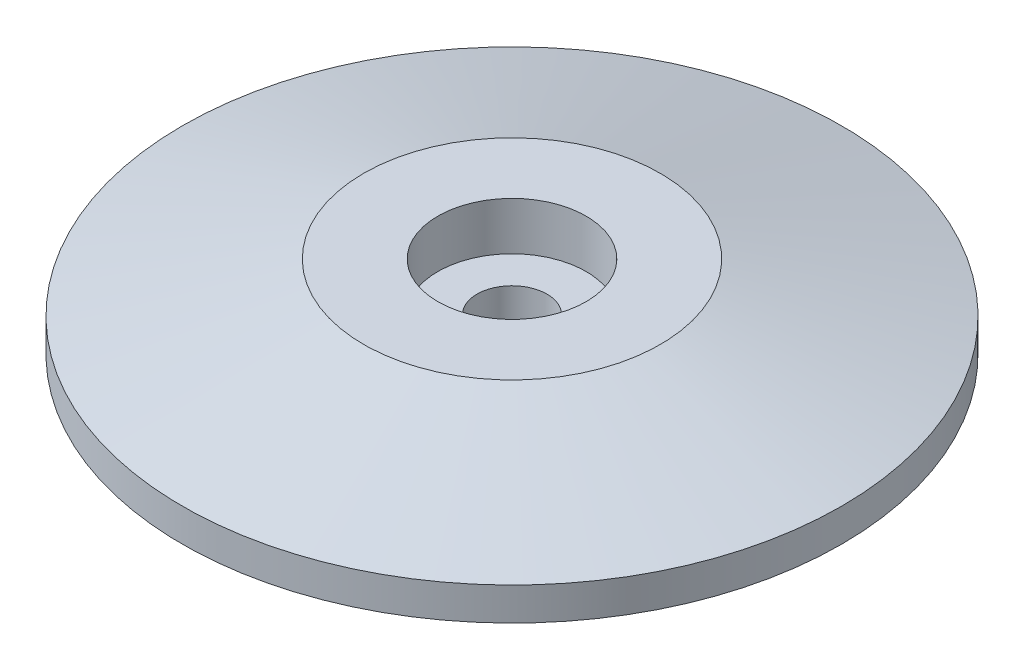
ISO-10303-21;
HEADER;
FILE_DESCRIPTION(('STEP AP214'),'2;1');
FILE_NAME('part.step','',(''),(''),'','','');
FILE_SCHEMA(('AUTOMOTIVE_DESIGN { 1 0 10303 214 1 1 1 1 }'));
ENDSEC;
DATA;
#1=APPLICATION_CONTEXT('core data for automotive mechanical design processes');
#2=APPLICATION_PROTOCOL_DEFINITION('international standard','automotive_design',2000,#1);
#3=PRODUCT_CONTEXT('',#1,'mechanical');
#4=PRODUCT('Part','Part','',(#3));
#5=PRODUCT_RELATED_PRODUCT_CATEGORY('part','',(#4));
#6=PRODUCT_DEFINITION_FORMATION('','',#4);
#7=PRODUCT_DEFINITION_CONTEXT('part definition',#1,'design');
#8=PRODUCT_DEFINITION('design','',#6,#7);
#9=PRODUCT_DEFINITION_SHAPE('','',#8);
#10=(LENGTH_UNIT() NAMED_UNIT(*) SI_UNIT(.MILLI.,.METRE.));
#11=(NAMED_UNIT(*) PLANE_ANGLE_UNIT() SI_UNIT($,.RADIAN.));
#12=(NAMED_UNIT(*) SI_UNIT($,.STERADIAN.) SOLID_ANGLE_UNIT());
#13=UNCERTAINTY_MEASURE_WITH_UNIT(LENGTH_MEASURE(1.E-05),#10,'distance_accuracy_value','');
#14=(GEOMETRIC_REPRESENTATION_CONTEXT(3) GLOBAL_UNCERTAINTY_ASSIGNED_CONTEXT((#13)) GLOBAL_UNIT_ASSIGNED_CONTEXT((#10,
#11,#12)) REPRESENTATION_CONTEXT('',''));
#15=CARTESIAN_POINT('',(0.,0.,0.));
#16=DIRECTION('',(0.,0.,1.));
#17=DIRECTION('',(1.,0.,0.));
#18=AXIS2_PLACEMENT_3D('',#15,#16,#17);
#19=CARTESIAN_POINT('',(28.575,15.875,0.));
#20=DIRECTION('',(0.,-1.,0.));
#21=DIRECTION('',(1.,0.,0.));
#22=AXIS2_PLACEMENT_3D('',#19,#20,#21);
#23=PLANE('',#22);
#24=CARTESIAN_POINT('',(0.,15.875,0.));
#25=DIRECTION('',(0.,1.,0.));
#26=DIRECTION('',(0.,0.,1.));
#27=AXIS2_PLACEMENT_3D('',#24,#25,#26);
#28=CIRCLE('',#27,14.2875);
#29=CARTESIAN_POINT('',(0.,15.875,14.2875));
#30=VERTEX_POINT('',#29);
#31=EDGE_CURVE('E58',#30,#30,#28,.T.);
#32=ORIENTED_EDGE('',*,*,#31,.F.);
#33=EDGE_LOOP('',(#32));
#34=FACE_BOUND('',#33,.T.);
#35=CARTESIAN_POINT('',(0.,15.875,0.));
#36=DIRECTION('',(0.,1.,0.));
#37=DIRECTION('',(-1.,0.,0.));
#38=AXIS2_PLACEMENT_3D('',#35,#36,#37);
#39=CIRCLE('',#38,28.575);
#40=CARTESIAN_POINT('',(-28.575,15.875,0.));
#41=VERTEX_POINT('',#40);
#42=EDGE_CURVE('E10',#41,#41,#39,.T.);
#43=ORIENTED_EDGE('',*,*,#42,.T.);
#44=EDGE_LOOP('',(#43));
#45=FACE_BOUND('',#44,.T.);
#46=ADVANCED_FACE('F30',(#34,#45),#23,.F.);
#47=CARTESIAN_POINT('',(0.,6.35000000000001,0.));
#48=DIRECTION('',(0.,-1.,0.));
#49=DIRECTION('',(1.,0.,0.));
#50=AXIS2_PLACEMENT_3D('',#47,#48,#49);
#51=CONICAL_SURFACE('',#50,63.5,1.30454427764397);
#52=ORIENTED_EDGE('',*,*,#42,.F.);
#53=EDGE_LOOP('',(#52));
#54=FACE_BOUND('',#53,.T.);
#55=CARTESIAN_POINT('',(0.,6.35000000000001,0.));
#56=DIRECTION('',(0.,1.,0.));
#57=DIRECTION('',(-1.,0.,0.));
#58=AXIS2_PLACEMENT_3D('',#55,#56,#57);
#59=CIRCLE('',#58,63.5);
#60=CARTESIAN_POINT('',(-63.5,6.35000000000002,0.));
#61=VERTEX_POINT('',#60);
#62=EDGE_CURVE('E36',#61,#61,#59,.T.);
#63=ORIENTED_EDGE('',*,*,#62,.T.);
#64=EDGE_LOOP('',(#63));
#65=FACE_BOUND('',#64,.T.);
#66=ADVANCED_FACE('F93',(#54,#65),#51,.T.);
#67=CARTESIAN_POINT('',(0.,15.875,0.));
#68=DIRECTION('',(0.,1.,0.));
#69=DIRECTION('',(-1.,0.,0.));
#70=AXIS2_PLACEMENT_3D('',#67,#68,#69);
#71=CYLINDRICAL_SURFACE('',#70,63.5);
#72=ORIENTED_EDGE('',*,*,#62,.F.);
#73=EDGE_LOOP('',(#72));
#74=FACE_BOUND('',#73,.T.);
#75=CARTESIAN_POINT('',(0.,0.,0.));
#76=DIRECTION('',(0.,1.,0.));
#77=DIRECTION('',(-1.,0.,0.));
#78=AXIS2_PLACEMENT_3D('',#75,#76,#77);
#79=CIRCLE('',#78,63.5);
#80=CARTESIAN_POINT('',(-63.5,0.,0.));
#81=VERTEX_POINT('',#80);
#82=EDGE_CURVE('E40',#81,#81,#79,.T.);
#83=ORIENTED_EDGE('',*,*,#82,.T.);
#84=EDGE_LOOP('',(#83));
#85=FACE_BOUND('',#84,.T.);
#86=ADVANCED_FACE('F97',(#74,#85),#71,.T.);
#87=CARTESIAN_POINT('',(0.,0.,0.));
#88=DIRECTION('',(0.,1.,0.));
#89=DIRECTION('',(-1.,0.,0.));
#90=AXIS2_PLACEMENT_3D('',#87,#88,#89);
#91=PLANE('',#90);
#92=CARTESIAN_POINT('',(0.,0.,0.));
#93=DIRECTION('',(0.,-1.,0.));
#94=DIRECTION('',(0.,0.,-1.));
#95=AXIS2_PLACEMENT_3D('',#92,#93,#94);
#96=CIRCLE('',#95,31.75);
#97=CARTESIAN_POINT('',(0.,0.,-31.75));
#98=VERTEX_POINT('',#97);
#99=EDGE_CURVE('E52',#98,#98,#96,.T.);
#100=ORIENTED_EDGE('',*,*,#99,.F.);
#101=EDGE_LOOP('',(#100));
#102=FACE_BOUND('',#101,.T.);
#103=ORIENTED_EDGE('',*,*,#82,.F.);
#104=EDGE_LOOP('',(#103));
#105=FACE_BOUND('',#104,.T.);
#106=ADVANCED_FACE('F102',(#102,#105),#91,.F.);
#107=CARTESIAN_POINT('',(0.,0.,0.));
#108=DIRECTION('',(0.,-1.,0.));
#109=DIRECTION('',(0.,0.,-1.));
#110=AXIS2_PLACEMENT_3D('',#107,#108,#109);
#111=CYLINDRICAL_SURFACE('',#110,26.9875);
#112=CARTESIAN_POINT('',(0.,0.,0.));
#113=DIRECTION('',(0.,-1.,0.));
#114=DIRECTION('',(0.,0.,-1.));
#115=AXIS2_PLACEMENT_3D('',#112,#113,#114);
#116=CIRCLE('',#115,26.9875);
#117=CARTESIAN_POINT('',(0.,0.,-26.9875));
#118=VERTEX_POINT('',#117);
#119=EDGE_CURVE('E55',#118,#118,#116,.T.);
#120=ORIENTED_EDGE('',*,*,#119,.F.);
#121=EDGE_LOOP('',(#120));
#122=FACE_BOUND('',#121,.T.);
#123=CARTESIAN_POINT('',(0.,3.17500000000002,0.));
#124=DIRECTION('',(0.,-1.,0.));
#125=DIRECTION('',(0.,0.,-1.));
#126=AXIS2_PLACEMENT_3D('',#123,#124,#125);
#127=CIRCLE('',#126,26.9875);
#128=CARTESIAN_POINT('',(0.,3.17500000000002,-26.9875));
#129=VERTEX_POINT('',#128);
#130=EDGE_CURVE('E44',#129,#129,#127,.T.);
#131=ORIENTED_EDGE('',*,*,#130,.T.);
#132=EDGE_LOOP('',(#131));
#133=FACE_BOUND('',#132,.T.);
#134=ADVANCED_FACE('F108',(#122,#133),#111,.T.);
#135=CARTESIAN_POINT('',(26.9875,3.17500000000002,0.));
#136=DIRECTION('',(0.,1.,0.));
#137=DIRECTION('',(0.,0.,1.));
#138=AXIS2_PLACEMENT_3D('',#135,#136,#137);
#139=PLANE('',#138);
#140=ORIENTED_EDGE('',*,*,#130,.F.);
#141=EDGE_LOOP('',(#140));
#142=FACE_BOUND('',#141,.T.);
#143=CARTESIAN_POINT('',(0.,3.17500000000002,0.));
#144=DIRECTION('',(0.,-1.,0.));
#145=DIRECTION('',(0.,0.,-1.));
#146=AXIS2_PLACEMENT_3D('',#143,#144,#145);
#147=CIRCLE('',#146,31.75);
#148=CARTESIAN_POINT('',(0.,3.17500000000002,-31.75));
#149=VERTEX_POINT('',#148);
#150=EDGE_CURVE('E49',#149,#149,#147,.T.);
#151=ORIENTED_EDGE('',*,*,#150,.T.);
#152=EDGE_LOOP('',(#151));
#153=FACE_BOUND('',#152,.T.);
#154=ADVANCED_FACE('F112',(#142,#153),#139,.F.);
#155=CARTESIAN_POINT('',(0.,0.,0.));
#156=DIRECTION('',(0.,-1.,0.));
#157=DIRECTION('',(0.,0.,-1.));
#158=AXIS2_PLACEMENT_3D('',#155,#156,#157);
#159=CYLINDRICAL_SURFACE('',#158,31.75);
#160=ORIENTED_EDGE('',*,*,#150,.F.);
#161=EDGE_LOOP('',(#160));
#162=FACE_BOUND('',#161,.T.);
#163=ORIENTED_EDGE('',*,*,#99,.T.);
#164=EDGE_LOOP('',(#163));
#165=FACE_BOUND('',#164,.T.);
#166=ADVANCED_FACE('F116',(#162,#165),#159,.F.);
#167=CARTESIAN_POINT('',(0.,0.,0.));
#168=DIRECTION('',(0.,1.,0.));
#169=DIRECTION('',(0.,0.,1.));
#170=AXIS2_PLACEMENT_3D('',#167,#168,#169);
#171=CIRCLE('',#170,6.74624);
#172=CARTESIAN_POINT('',(0.,0.,6.74624));
#173=VERTEX_POINT('',#172);
#174=EDGE_CURVE('E67',#173,#173,#171,.T.);
#175=ORIENTED_EDGE('',*,*,#174,.T.);
#176=EDGE_LOOP('',(#175));
#177=FACE_BOUND('',#176,.T.);
#178=ORIENTED_EDGE('',*,*,#119,.T.);
#179=EDGE_LOOP('',(#178));
#180=FACE_BOUND('',#179,.T.);
#181=ADVANCED_FACE('F71',(#177,#180),#91,.F.);
#182=CARTESIAN_POINT('',(0.,15.875,0.));
#183=DIRECTION('',(0.,1.,0.));
#184=DIRECTION('',(0.,0.,1.));
#185=AXIS2_PLACEMENT_3D('',#182,#183,#184);
#186=CYLINDRICAL_SURFACE('',#185,14.2875);
#187=CARTESIAN_POINT('',(0.,6.6294,0.));
#188=DIRECTION('',(0.,1.,0.));
#189=DIRECTION('',(0.,0.,1.));
#190=AXIS2_PLACEMENT_3D('',#187,#188,#189);
#191=CIRCLE('',#190,14.2875);
#192=CARTESIAN_POINT('',(0.,6.6294,14.2875));
#193=VERTEX_POINT('',#192);
#194=EDGE_CURVE('E61',#193,#193,#191,.T.);
#195=ORIENTED_EDGE('',*,*,#194,.F.);
#196=EDGE_LOOP('',(#195));
#197=FACE_BOUND('',#196,.T.);
#198=ORIENTED_EDGE('',*,*,#31,.T.);
#199=EDGE_LOOP('',(#198));
#200=FACE_BOUND('',#199,.T.);
#201=ADVANCED_FACE('F83',(#197,#200),#186,.F.);
#202=CARTESIAN_POINT('',(6.74624,6.6294,0.));
#203=DIRECTION('',(0.,-1.,0.));
#204=DIRECTION('',(0.,0.,-1.));
#205=AXIS2_PLACEMENT_3D('',#202,#203,#204);
#206=PLANE('',#205);
#207=CARTESIAN_POINT('',(0.,6.6294,0.));
#208=DIRECTION('',(0.,1.,0.));
#209=DIRECTION('',(0.,0.,1.));
#210=AXIS2_PLACEMENT_3D('',#207,#208,#209);
#211=CIRCLE('',#210,6.74624);
#212=CARTESIAN_POINT('',(0.,6.6294,6.74624));
#213=VERTEX_POINT('',#212);
#214=EDGE_CURVE('E64',#213,#213,#211,.T.);
#215=ORIENTED_EDGE('',*,*,#214,.F.);
#216=EDGE_LOOP('',(#215));
#217=FACE_BOUND('',#216,.T.);
#218=ORIENTED_EDGE('',*,*,#194,.T.);
#219=EDGE_LOOP('',(#218));
#220=FACE_BOUND('',#219,.T.);
#221=ADVANCED_FACE('F77',(#217,#220),#206,.F.);
#222=CARTESIAN_POINT('',(0.,15.875,0.));
#223=DIRECTION('',(0.,1.,0.));
#224=DIRECTION('',(0.,0.,1.));
#225=AXIS2_PLACEMENT_3D('',#222,#223,#224);
#226=CYLINDRICAL_SURFACE('',#225,6.74624);
#227=ORIENTED_EDGE('',*,*,#174,.F.);
#228=EDGE_LOOP('',(#227));
#229=FACE_BOUND('',#228,.T.);
#230=ORIENTED_EDGE('',*,*,#214,.T.);
#231=EDGE_LOOP('',(#230));
#232=FACE_BOUND('',#231,.T.);
#233=ADVANCED_FACE('F74',(#229,#232),#226,.F.);
#234=CLOSED_SHELL('',(#46,#66,#86,#106,#134,#154,#166,#181,#201,#221,#233));
#235=MANIFOLD_SOLID_BREP('B2',#234);
#236=ADVANCED_BREP_SHAPE_REPRESENTATION('',(#18,#235),#14);
#237=SHAPE_DEFINITION_REPRESENTATION(#9,#236);
ENDSEC;
END-ISO-10303-21;
